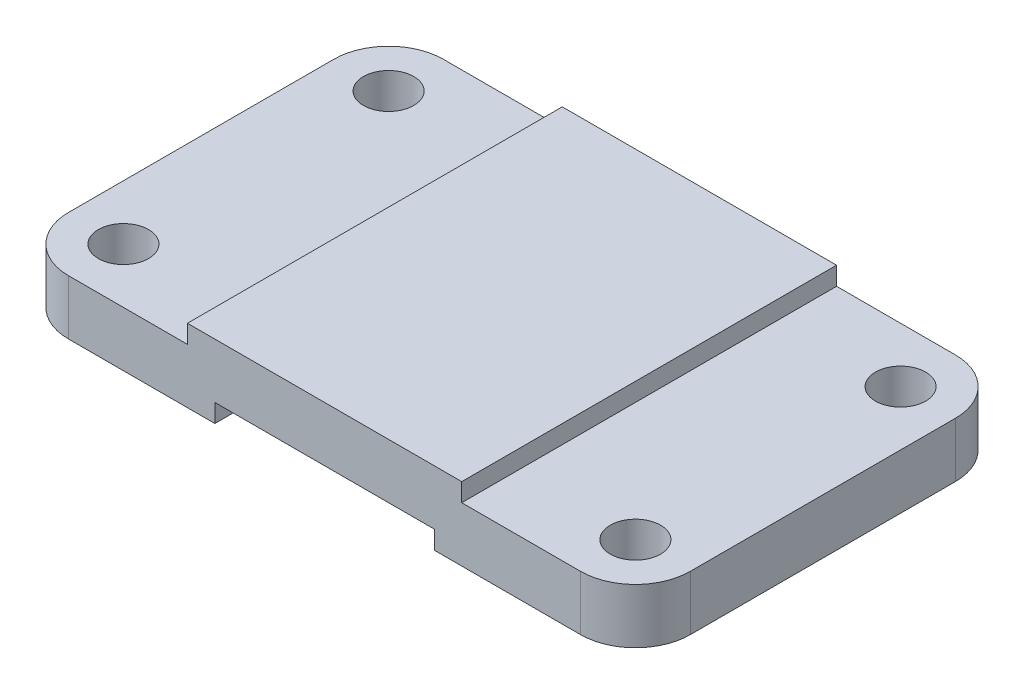
ISO-10303-21;
HEADER;
FILE_DESCRIPTION(('STEP AP214'),'2;1');
FILE_NAME('part.step','',(''),(''),'','','');
FILE_SCHEMA(('AUTOMOTIVE_DESIGN { 1 0 10303 214 1 1 1 1 }'));
ENDSEC;
DATA;
#1=APPLICATION_CONTEXT('core data for automotive mechanical design processes');
#2=APPLICATION_PROTOCOL_DEFINITION('international standard','automotive_design',2000,#1);
#3=PRODUCT_CONTEXT('',#1,'mechanical');
#4=PRODUCT('Part','Part','',(#3));
#5=PRODUCT_RELATED_PRODUCT_CATEGORY('part','',(#4));
#6=PRODUCT_DEFINITION_FORMATION('','',#4);
#7=PRODUCT_DEFINITION_CONTEXT('part definition',#1,'design');
#8=PRODUCT_DEFINITION('design','',#6,#7);
#9=PRODUCT_DEFINITION_SHAPE('','',#8);
#10=(LENGTH_UNIT() NAMED_UNIT(*) SI_UNIT(.MILLI.,.METRE.));
#11=(NAMED_UNIT(*) PLANE_ANGLE_UNIT() SI_UNIT($,.RADIAN.));
#12=(NAMED_UNIT(*) SI_UNIT($,.STERADIAN.) SOLID_ANGLE_UNIT());
#13=UNCERTAINTY_MEASURE_WITH_UNIT(LENGTH_MEASURE(1.E-05),#10,'distance_accuracy_value','');
#14=(GEOMETRIC_REPRESENTATION_CONTEXT(3) GLOBAL_UNCERTAINTY_ASSIGNED_CONTEXT((#13)) GLOBAL_UNIT_ASSIGNED_CONTEXT((#10,
#11,#12)) REPRESENTATION_CONTEXT('',''));
#15=CARTESIAN_POINT('',(0.,0.,0.));
#16=DIRECTION('',(0.,0.,1.));
#17=DIRECTION('',(1.,0.,0.));
#18=AXIS2_PLACEMENT_3D('',#15,#16,#17);
#19=CARTESIAN_POINT('',(0.,0.,0.));
#20=DIRECTION('',(0.,-1.,0.));
#21=DIRECTION('',(0.,0.,-1.));
#22=AXIS2_PLACEMENT_3D('',#19,#20,#21);
#23=PLANE('',#22);
#24=CARTESIAN_POINT('',(-56.,0.,-29.));
#25=DIRECTION('',(0.,1.,0.));
#26=DIRECTION('',(0.,0.,1.));
#27=AXIS2_PLACEMENT_3D('',#24,#25,#26);
#28=CIRCLE('',#27,5.5);
#29=CARTESIAN_POINT('',(-56.,0.,-23.5));
#30=VERTEX_POINT('',#29);
#31=EDGE_CURVE('E515',#30,#30,#28,.T.);
#32=ORIENTED_EDGE('',*,*,#31,.T.);
#33=EDGE_LOOP('',(#32));
#34=FACE_BOUND('',#33,.T.);
#35=CARTESIAN_POINT('',(-56.,0.,29.));
#36=DIRECTION('',(0.,1.,0.));
#37=DIRECTION('',(0.,0.,1.));
#38=AXIS2_PLACEMENT_3D('',#35,#36,#37);
#39=CIRCLE('',#38,5.5);
#40=CARTESIAN_POINT('',(-56.,0.,34.5));
#41=VERTEX_POINT('',#40);
#42=EDGE_CURVE('E215',#41,#41,#39,.T.);
#43=ORIENTED_EDGE('',*,*,#42,.T.);
#44=EDGE_LOOP('',(#43));
#45=FACE_BOUND('',#44,.T.);
#46=DIRECTION('',(1.,0.,0.));
#47=VECTOR('',#46,1.);
#48=CARTESIAN_POINT('',(-68.,0.,41.));
#49=LINE('',#48,#47);
#50=CARTESIAN_POINT('',(-56.,0.,41.));
#51=VERTEX_POINT('',#50);
#52=CARTESIAN_POINT('',(-24.,0.,41.));
#53=VERTEX_POINT('',#52);
#54=EDGE_CURVE('E226',#51,#53,#49,.T.);
#55=ORIENTED_EDGE('',*,*,#54,.F.);
#56=CARTESIAN_POINT('',(-56.,0.,29.));
#57=DIRECTION('',(0.,-1.,0.));
#58=DIRECTION('',(0.,0.,-1.));
#59=AXIS2_PLACEMENT_3D('',#56,#57,#58);
#60=CIRCLE('',#59,12.);
#61=CARTESIAN_POINT('',(-68.,0.,29.));
#62=VERTEX_POINT('',#61);
#63=EDGE_CURVE('E262',#51,#62,#60,.T.);
#64=ORIENTED_EDGE('',*,*,#63,.T.);
#65=DIRECTION('',(0.,0.,1.));
#66=VECTOR('',#65,1.);
#67=CARTESIAN_POINT('',(-68.,0.,41.));
#68=LINE('',#67,#66);
#69=CARTESIAN_POINT('',(-68.,0.,-29.));
#70=VERTEX_POINT('',#69);
#71=EDGE_CURVE('E235',#70,#62,#68,.T.);
#72=ORIENTED_EDGE('',*,*,#71,.F.);
#73=CARTESIAN_POINT('',(-56.,0.,-29.));
#74=DIRECTION('',(0.,-1.,0.));
#75=DIRECTION('',(0.,0.,-1.));
#76=AXIS2_PLACEMENT_3D('',#73,#74,#75);
#77=CIRCLE('',#76,12.);
#78=CARTESIAN_POINT('',(-56.,0.,-41.));
#79=VERTEX_POINT('',#78);
#80=EDGE_CURVE('E260',#70,#79,#77,.T.);
#81=ORIENTED_EDGE('',*,*,#80,.T.);
#82=DIRECTION('',(-1.,0.,0.));
#83=VECTOR('',#82,1.);
#84=CARTESIAN_POINT('',(-68.,0.,-41.));
#85=LINE('',#84,#83);
#86=CARTESIAN_POINT('',(-24.,0.,-41.));
#87=VERTEX_POINT('',#86);
#88=EDGE_CURVE('E232',#87,#79,#85,.T.);
#89=ORIENTED_EDGE('',*,*,#88,.F.);
#90=DIRECTION('',(0.,0.,1.));
#91=VECTOR('',#90,1.);
#92=CARTESIAN_POINT('',(-24.,0.,-41.));
#93=LINE('',#92,#91);
#94=EDGE_CURVE('E174',#87,#53,#93,.T.);
#95=ORIENTED_EDGE('',*,*,#94,.T.);
#96=EDGE_LOOP('',(#55,#64,#72,#81,#89,#95));
#97=FACE_BOUND('',#96,.T.);
#98=ADVANCED_FACE('F32',(#34,#45,#97),#23,.T.);
#99=CARTESIAN_POINT('',(68.,16.,41.));
#100=DIRECTION('',(-1.,0.,0.));
#101=DIRECTION('',(0.,0.,1.));
#102=AXIS2_PLACEMENT_3D('',#99,#100,#101);
#103=PLANE('',#102);
#104=DIRECTION('',(0.,0.,1.));
#105=VECTOR('',#104,1.);
#106=CARTESIAN_POINT('',(68.,12.,-41.));
#107=LINE('',#106,#105);
#108=CARTESIAN_POINT('',(68.,12.,-29.));
#109=VERTEX_POINT('',#108);
#110=CARTESIAN_POINT('',(68.,12.,29.));
#111=VERTEX_POINT('',#110);
#112=EDGE_CURVE('E193',#109,#111,#107,.T.);
#113=ORIENTED_EDGE('',*,*,#112,.T.);
#114=DIRECTION('',(0.,-1.,0.));
#115=VECTOR('',#114,1.);
#116=CARTESIAN_POINT('',(68.,16.,29.));
#117=LINE('',#116,#115);
#118=CARTESIAN_POINT('',(68.,0.,29.));
#119=VERTEX_POINT('',#118);
#120=EDGE_CURVE('E240',#111,#119,#117,.T.);
#121=ORIENTED_EDGE('',*,*,#120,.T.);
#122=DIRECTION('',(0.,0.,-1.));
#123=VECTOR('',#122,1.);
#124=CARTESIAN_POINT('',(68.,0.,41.));
#125=LINE('',#124,#123);
#126=CARTESIAN_POINT('',(68.,0.,-29.));
#127=VERTEX_POINT('',#126);
#128=EDGE_CURVE('E176',#119,#127,#125,.T.);
#129=ORIENTED_EDGE('',*,*,#128,.T.);
#130=DIRECTION('',(0.,-1.,0.));
#131=VECTOR('',#130,1.);
#132=CARTESIAN_POINT('',(68.,16.,-29.));
#133=LINE('',#132,#131);
#134=EDGE_CURVE('E229',#127,#109,#133,.F.);
#135=ORIENTED_EDGE('',*,*,#134,.T.);
#136=EDGE_LOOP('',(#113,#121,#129,#135));
#137=FACE_BOUND('',#136,.T.);
#138=ADVANCED_FACE('F328',(#137),#103,.F.);
#139=CARTESIAN_POINT('',(-68.,16.,-41.));
#140=DIRECTION('',(0.,0.,1.));
#141=DIRECTION('',(1.,0.,0.));
#142=AXIS2_PLACEMENT_3D('',#139,#140,#141);
#143=PLANE('',#142);
#144=DIRECTION('',(1.,0.,0.));
#145=VECTOR('',#144,1.);
#146=CARTESIAN_POINT('',(68.,12.,-41.));
#147=LINE('',#146,#145);
#148=CARTESIAN_POINT('',(30.,12.,-41.));
#149=VERTEX_POINT('',#148);
#150=CARTESIAN_POINT('',(56.,12.,-41.));
#151=VERTEX_POINT('',#150);
#152=EDGE_CURVE('E208',#149,#151,#147,.T.);
#153=ORIENTED_EDGE('',*,*,#152,.T.);
#154=DIRECTION('',(0.,-1.,0.));
#155=VECTOR('',#154,1.);
#156=CARTESIAN_POINT('',(56.,16.,-41.));
#157=LINE('',#156,#155);
#158=CARTESIAN_POINT('',(56.,0.,-41.));
#159=VERTEX_POINT('',#158);
#160=EDGE_CURVE('E257',#151,#159,#157,.T.);
#161=ORIENTED_EDGE('',*,*,#160,.T.);
#162=CARTESIAN_POINT('',(24.,0.,-41.));
#163=VERTEX_POINT('',#162);
#164=EDGE_CURVE('E233',#159,#163,#85,.T.);
#165=ORIENTED_EDGE('',*,*,#164,.T.);
#166=DIRECTION('',(0.,1.,0.));
#167=VECTOR('',#166,1.);
#168=CARTESIAN_POINT('',(24.,0.,-41.));
#169=LINE('',#168,#167);
#170=CARTESIAN_POINT('',(24.,4.00000000000001,-41.));
#171=VERTEX_POINT('',#170);
#172=EDGE_CURVE('E178',#163,#171,#169,.T.);
#173=ORIENTED_EDGE('',*,*,#172,.T.);
#174=DIRECTION('',(-1.,0.,0.));
#175=VECTOR('',#174,1.);
#176=CARTESIAN_POINT('',(-24.,4.,-41.));
#177=LINE('',#176,#175);
#178=CARTESIAN_POINT('',(-24.,4.,-41.));
#179=VERTEX_POINT('',#178);
#180=EDGE_CURVE('E181',#171,#179,#177,.T.);
#181=ORIENTED_EDGE('',*,*,#180,.T.);
#182=DIRECTION('',(0.,-1.,0.));
#183=VECTOR('',#182,1.);
#184=CARTESIAN_POINT('',(-24.,0.,-41.));
#185=LINE('',#184,#183);
#186=EDGE_CURVE('E185',#179,#87,#185,.T.);
#187=ORIENTED_EDGE('',*,*,#186,.T.);
#188=ORIENTED_EDGE('',*,*,#88,.T.);
#189=DIRECTION('',(0.,-1.,0.));
#190=VECTOR('',#189,1.);
#191=CARTESIAN_POINT('',(-56.,16.,-41.));
#192=LINE('',#191,#190);
#193=CARTESIAN_POINT('',(-56.,12.,-41.));
#194=VERTEX_POINT('',#193);
#195=EDGE_CURVE('E154',#79,#194,#192,.F.);
#196=ORIENTED_EDGE('',*,*,#195,.T.);
#197=DIRECTION('',(1.,0.,0.));
#198=VECTOR('',#197,1.);
#199=CARTESIAN_POINT('',(-68.,12.,-41.));
#200=LINE('',#199,#198);
#201=CARTESIAN_POINT('',(-30.,12.,-41.));
#202=VERTEX_POINT('',#201);
#203=EDGE_CURVE('E144',#194,#202,#200,.T.);
#204=ORIENTED_EDGE('',*,*,#203,.T.);
#205=DIRECTION('',(0.,1.,0.));
#206=VECTOR('',#205,1.);
#207=CARTESIAN_POINT('',(-30.,12.,-41.));
#208=LINE('',#207,#206);
#209=CARTESIAN_POINT('',(-30.,16.,-41.));
#210=VERTEX_POINT('',#209);
#211=EDGE_CURVE('E150',#202,#210,#208,.T.);
#212=ORIENTED_EDGE('',*,*,#211,.T.);
#213=DIRECTION('',(-1.,0.,0.));
#214=VECTOR('',#213,1.);
#215=CARTESIAN_POINT('',(-68.,16.,-41.));
#216=LINE('',#215,#214);
#217=CARTESIAN_POINT('',(30.,16.,-41.));
#218=VERTEX_POINT('',#217);
#219=EDGE_CURVE('E223',#218,#210,#216,.T.);
#220=ORIENTED_EDGE('',*,*,#219,.F.);
#221=DIRECTION('',(0.,-1.,0.));
#222=VECTOR('',#221,1.);
#223=CARTESIAN_POINT('',(30.,12.,-41.));
#224=LINE('',#223,#222);
#225=EDGE_CURVE('E205',#218,#149,#224,.T.);
#226=ORIENTED_EDGE('',*,*,#225,.T.);
#227=EDGE_LOOP('',(#153,#161,#165,#173,#181,#187,#188,#196,#204,#212,#220,#226));
#228=FACE_BOUND('',#227,.T.);
#229=ADVANCED_FACE('F147',(#228),#143,.F.);
#230=CARTESIAN_POINT('',(-68.,16.,41.));
#231=DIRECTION('',(1.,0.,0.));
#232=DIRECTION('',(0.,0.,-1.));
#233=AXIS2_PLACEMENT_3D('',#230,#231,#232);
#234=PLANE('',#233);
#235=ORIENTED_EDGE('',*,*,#71,.T.);
#236=DIRECTION('',(0.,-1.,0.));
#237=VECTOR('',#236,1.);
#238=CARTESIAN_POINT('',(-68.,16.,29.));
#239=LINE('',#238,#237);
#240=CARTESIAN_POINT('',(-68.,12.,29.));
#241=VERTEX_POINT('',#240);
#242=EDGE_CURVE('E47',#62,#241,#239,.F.);
#243=ORIENTED_EDGE('',*,*,#242,.T.);
#244=DIRECTION('',(0.,0.,1.));
#245=VECTOR('',#244,1.);
#246=CARTESIAN_POINT('',(-68.,12.,-41.));
#247=LINE('',#246,#245);
#248=CARTESIAN_POINT('',(-68.,12.,-29.));
#249=VERTEX_POINT('',#248);
#250=EDGE_CURVE('E165',#249,#241,#247,.T.);
#251=ORIENTED_EDGE('',*,*,#250,.F.);
#252=DIRECTION('',(0.,-1.,0.));
#253=VECTOR('',#252,1.);
#254=CARTESIAN_POINT('',(-68.,16.,-29.));
#255=LINE('',#254,#253);
#256=EDGE_CURVE('E264',#249,#70,#255,.T.);
#257=ORIENTED_EDGE('',*,*,#256,.T.);
#258=EDGE_LOOP('',(#235,#243,#251,#257));
#259=FACE_BOUND('',#258,.T.);
#260=ADVANCED_FACE('F269',(#259),#234,.F.);
#261=CARTESIAN_POINT('',(-68.,16.,41.));
#262=DIRECTION('',(0.,0.,-1.));
#263=DIRECTION('',(-1.,0.,0.));
#264=AXIS2_PLACEMENT_3D('',#261,#262,#263);
#265=PLANE('',#264);
#266=CARTESIAN_POINT('',(24.,0.,41.));
#267=VERTEX_POINT('',#266);
#268=CARTESIAN_POINT('',(56.,0.,41.));
#269=VERTEX_POINT('',#268);
#270=EDGE_CURVE('E237',#267,#269,#49,.T.);
#271=ORIENTED_EDGE('',*,*,#270,.T.);
#272=DIRECTION('',(0.,-1.,0.));
#273=VECTOR('',#272,1.);
#274=CARTESIAN_POINT('',(56.,16.,41.));
#275=LINE('',#274,#273);
#276=CARTESIAN_POINT('',(56.,12.,41.));
#277=VERTEX_POINT('',#276);
#278=EDGE_CURVE('E250',#269,#277,#275,.F.);
#279=ORIENTED_EDGE('',*,*,#278,.T.);
#280=DIRECTION('',(1.,0.,0.));
#281=VECTOR('',#280,1.);
#282=CARTESIAN_POINT('',(68.,12.,41.));
#283=LINE('',#282,#281);
#284=CARTESIAN_POINT('',(30.,12.,41.));
#285=VERTEX_POINT('',#284);
#286=EDGE_CURVE('E209',#285,#277,#283,.T.);
#287=ORIENTED_EDGE('',*,*,#286,.F.);
#288=DIRECTION('',(0.,-1.,0.));
#289=VECTOR('',#288,1.);
#290=CARTESIAN_POINT('',(30.,12.,41.));
#291=LINE('',#290,#289);
#292=CARTESIAN_POINT('',(30.,16.,41.));
#293=VERTEX_POINT('',#292);
#294=EDGE_CURVE('E212',#293,#285,#291,.T.);
#295=ORIENTED_EDGE('',*,*,#294,.F.);
#296=DIRECTION('',(1.,0.,0.));
#297=VECTOR('',#296,1.);
#298=CARTESIAN_POINT('',(-68.,16.,41.));
#299=LINE('',#298,#297);
#300=CARTESIAN_POINT('',(-30.,16.,41.));
#301=VERTEX_POINT('',#300);
#302=EDGE_CURVE('E225',#301,#293,#299,.T.);
#303=ORIENTED_EDGE('',*,*,#302,.F.);
#304=DIRECTION('',(0.,1.,0.));
#305=VECTOR('',#304,1.);
#306=CARTESIAN_POINT('',(-30.,12.,41.));
#307=LINE('',#306,#305);
#308=CARTESIAN_POINT('',(-30.,12.,41.));
#309=VERTEX_POINT('',#308);
#310=EDGE_CURVE('E155',#309,#301,#307,.T.);
#311=ORIENTED_EDGE('',*,*,#310,.F.);
#312=DIRECTION('',(1.,0.,0.));
#313=VECTOR('',#312,1.);
#314=CARTESIAN_POINT('',(-68.,12.,41.));
#315=LINE('',#314,#313);
#316=CARTESIAN_POINT('',(-56.,12.,41.));
#317=VERTEX_POINT('',#316);
#318=EDGE_CURVE('E161',#317,#309,#315,.T.);
#319=ORIENTED_EDGE('',*,*,#318,.F.);
#320=DIRECTION('',(0.,-1.,0.));
#321=VECTOR('',#320,1.);
#322=CARTESIAN_POINT('',(-56.,16.,41.));
#323=LINE('',#322,#321);
#324=EDGE_CURVE('E247',#317,#51,#323,.T.);
#325=ORIENTED_EDGE('',*,*,#324,.T.);
#326=ORIENTED_EDGE('',*,*,#54,.T.);
#327=DIRECTION('',(0.,-1.,0.));
#328=VECTOR('',#327,1.);
#329=CARTESIAN_POINT('',(-24.,0.,41.));
#330=LINE('',#329,#328);
#331=CARTESIAN_POINT('',(-24.,4.,41.));
#332=VERTEX_POINT('',#331);
#333=EDGE_CURVE('E182',#332,#53,#330,.T.);
#334=ORIENTED_EDGE('',*,*,#333,.F.);
#335=DIRECTION('',(-1.,0.,0.));
#336=VECTOR('',#335,1.);
#337=CARTESIAN_POINT('',(-24.,4.,41.));
#338=LINE('',#337,#336);
#339=CARTESIAN_POINT('',(24.,4.00000000000001,41.));
#340=VERTEX_POINT('',#339);
#341=EDGE_CURVE('E192',#340,#332,#338,.T.);
#342=ORIENTED_EDGE('',*,*,#341,.F.);
#343=DIRECTION('',(0.,1.,0.));
#344=VECTOR('',#343,1.);
#345=CARTESIAN_POINT('',(24.,0.,41.));
#346=LINE('',#345,#344);
#347=EDGE_CURVE('E189',#267,#340,#346,.T.);
#348=ORIENTED_EDGE('',*,*,#347,.F.);
#349=EDGE_LOOP('',(#271,#279,#287,#295,#303,#311,#319,#325,#326,#334,#342,#348));
#350=FACE_BOUND('',#349,.T.);
#351=ADVANCED_FACE('F280',(#350),#265,.F.);
#352=CARTESIAN_POINT('',(0.,16.,0.));
#353=DIRECTION('',(0.,-1.,0.));
#354=DIRECTION('',(0.,0.,-1.));
#355=AXIS2_PLACEMENT_3D('',#352,#353,#354);
#356=PLANE('',#355);
#357=ORIENTED_EDGE('',*,*,#219,.T.);
#358=DIRECTION('',(0.,0.,1.));
#359=VECTOR('',#358,1.);
#360=CARTESIAN_POINT('',(-30.,16.,-41.));
#361=LINE('',#360,#359);
#362=EDGE_CURVE('E164',#210,#301,#361,.T.);
#363=ORIENTED_EDGE('',*,*,#362,.T.);
#364=ORIENTED_EDGE('',*,*,#302,.T.);
#365=DIRECTION('',(0.,0.,1.));
#366=VECTOR('',#365,1.);
#367=CARTESIAN_POINT('',(30.,16.,-41.));
#368=LINE('',#367,#366);
#369=EDGE_CURVE('E211',#218,#293,#368,.T.);
#370=ORIENTED_EDGE('',*,*,#369,.F.);
#371=EDGE_LOOP('',(#357,#363,#364,#370));
#372=FACE_BOUND('',#371,.T.);
#373=ADVANCED_FACE('F285',(#372),#356,.F.);
#374=CARTESIAN_POINT('',(56.,0.,29.));
#375=DIRECTION('',(0.,1.,0.));
#376=DIRECTION('',(0.,0.,1.));
#377=AXIS2_PLACEMENT_3D('',#374,#375,#376);
#378=CIRCLE('',#377,5.5);
#379=CARTESIAN_POINT('',(56.,0.,34.5));
#380=VERTEX_POINT('',#379);
#381=EDGE_CURVE('E523',#380,#380,#378,.T.);
#382=ORIENTED_EDGE('',*,*,#381,.T.);
#383=EDGE_LOOP('',(#382));
#384=FACE_BOUND('',#383,.T.);
#385=CARTESIAN_POINT('',(56.,0.,-29.));
#386=DIRECTION('',(0.,1.,0.));
#387=DIRECTION('',(0.,0.,1.));
#388=AXIS2_PLACEMENT_3D('',#385,#386,#387);
#389=CIRCLE('',#388,5.5);
#390=CARTESIAN_POINT('',(56.,0.,-23.5));
#391=VERTEX_POINT('',#390);
#392=EDGE_CURVE('E524',#391,#391,#389,.T.);
#393=ORIENTED_EDGE('',*,*,#392,.T.);
#394=EDGE_LOOP('',(#393));
#395=FACE_BOUND('',#394,.T.);
#396=ORIENTED_EDGE('',*,*,#128,.F.);
#397=CARTESIAN_POINT('',(56.,0.,29.));
#398=DIRECTION('',(0.,-1.,0.));
#399=DIRECTION('',(0.,0.,-1.));
#400=AXIS2_PLACEMENT_3D('',#397,#398,#399);
#401=CIRCLE('',#400,12.);
#402=EDGE_CURVE('E245',#119,#269,#401,.T.);
#403=ORIENTED_EDGE('',*,*,#402,.T.);
#404=ORIENTED_EDGE('',*,*,#270,.F.);
#405=DIRECTION('',(0.,0.,1.));
#406=VECTOR('',#405,1.);
#407=CARTESIAN_POINT('',(24.,0.,-41.));
#408=LINE('',#407,#406);
#409=EDGE_CURVE('E188',#163,#267,#408,.T.);
#410=ORIENTED_EDGE('',*,*,#409,.F.);
#411=ORIENTED_EDGE('',*,*,#164,.F.);
#412=CARTESIAN_POINT('',(56.,0.,-29.));
#413=DIRECTION('',(0.,-1.,0.));
#414=DIRECTION('',(0.,0.,-1.));
#415=AXIS2_PLACEMENT_3D('',#412,#413,#414);
#416=CIRCLE('',#415,12.);
#417=EDGE_CURVE('E243',#159,#127,#416,.T.);
#418=ORIENTED_EDGE('',*,*,#417,.T.);
#419=EDGE_LOOP('',(#396,#403,#404,#410,#411,#418));
#420=FACE_BOUND('',#419,.T.);
#421=ADVANCED_FACE('F304',(#384,#395,#420),#23,.T.);
#422=CARTESIAN_POINT('',(-24.,0.,-41.));
#423=DIRECTION('',(-1.,0.,0.));
#424=DIRECTION('',(0.,0.,1.));
#425=AXIS2_PLACEMENT_3D('',#422,#423,#424);
#426=PLANE('',#425);
#427=ORIENTED_EDGE('',*,*,#333,.T.);
#428=ORIENTED_EDGE('',*,*,#94,.F.);
#429=ORIENTED_EDGE('',*,*,#186,.F.);
#430=DIRECTION('',(0.,0.,1.));
#431=VECTOR('',#430,1.);
#432=CARTESIAN_POINT('',(-24.,4.,-41.));
#433=LINE('',#432,#431);
#434=EDGE_CURVE('E200',#179,#332,#433,.T.);
#435=ORIENTED_EDGE('',*,*,#434,.T.);
#436=EDGE_LOOP('',(#427,#428,#429,#435));
#437=FACE_BOUND('',#436,.T.);
#438=ADVANCED_FACE('F316',(#437),#426,.F.);
#439=CARTESIAN_POINT('',(-24.,4.,-41.));
#440=DIRECTION('',(0.,1.,0.));
#441=DIRECTION('',(-1.,0.,0.));
#442=AXIS2_PLACEMENT_3D('',#439,#440,#441);
#443=PLANE('',#442);
#444=ORIENTED_EDGE('',*,*,#341,.T.);
#445=ORIENTED_EDGE('',*,*,#434,.F.);
#446=ORIENTED_EDGE('',*,*,#180,.F.);
#447=DIRECTION('',(0.,0.,1.));
#448=VECTOR('',#447,1.);
#449=CARTESIAN_POINT('',(24.,4.00000000000001,-41.));
#450=LINE('',#449,#448);
#451=EDGE_CURVE('E202',#171,#340,#450,.T.);
#452=ORIENTED_EDGE('',*,*,#451,.T.);
#453=EDGE_LOOP('',(#444,#445,#446,#452));
#454=FACE_BOUND('',#453,.T.);
#455=ADVANCED_FACE('F312',(#454),#443,.F.);
#456=CARTESIAN_POINT('',(24.,0.,-41.));
#457=DIRECTION('',(1.,0.,0.));
#458=DIRECTION('',(0.,0.,-1.));
#459=AXIS2_PLACEMENT_3D('',#456,#457,#458);
#460=PLANE('',#459);
#461=ORIENTED_EDGE('',*,*,#347,.T.);
#462=ORIENTED_EDGE('',*,*,#451,.F.);
#463=ORIENTED_EDGE('',*,*,#172,.F.);
#464=ORIENTED_EDGE('',*,*,#409,.T.);
#465=EDGE_LOOP('',(#461,#462,#463,#464));
#466=FACE_BOUND('',#465,.T.);
#467=ADVANCED_FACE('F308',(#466),#460,.F.);
#468=CARTESIAN_POINT('',(68.,12.,-41.));
#469=DIRECTION('',(0.,-1.,0.));
#470=DIRECTION('',(1.,0.,0.));
#471=AXIS2_PLACEMENT_3D('',#468,#469,#470);
#472=PLANE('',#471);
#473=CARTESIAN_POINT('',(56.,12.,29.));
#474=DIRECTION('',(0.,1.,0.));
#475=DIRECTION('',(0.,0.,1.));
#476=AXIS2_PLACEMENT_3D('',#473,#474,#475);
#477=CIRCLE('',#476,5.5);
#478=CARTESIAN_POINT('',(56.,12.,34.5));
#479=VERTEX_POINT('',#478);
#480=EDGE_CURVE('E520',#479,#479,#477,.T.);
#481=ORIENTED_EDGE('',*,*,#480,.F.);
#482=EDGE_LOOP('',(#481));
#483=FACE_BOUND('',#482,.T.);
#484=CARTESIAN_POINT('',(56.,12.,-29.));
#485=DIRECTION('',(0.,1.,0.));
#486=DIRECTION('',(0.,0.,1.));
#487=AXIS2_PLACEMENT_3D('',#484,#485,#486);
#488=CIRCLE('',#487,5.5);
#489=CARTESIAN_POINT('',(56.,12.,-23.5));
#490=VERTEX_POINT('',#489);
#491=EDGE_CURVE('E529',#490,#490,#488,.T.);
#492=ORIENTED_EDGE('',*,*,#491,.F.);
#493=EDGE_LOOP('',(#492));
#494=FACE_BOUND('',#493,.T.);
#495=ORIENTED_EDGE('',*,*,#286,.T.);
#496=CARTESIAN_POINT('',(56.,12.,29.));
#497=DIRECTION('',(0.,-1.,0.));
#498=DIRECTION('',(1.,0.,0.));
#499=AXIS2_PLACEMENT_3D('',#496,#497,#498);
#500=CIRCLE('',#499,12.);
#501=EDGE_CURVE('E254',#277,#111,#500,.F.);
#502=ORIENTED_EDGE('',*,*,#501,.T.);
#503=ORIENTED_EDGE('',*,*,#112,.F.);
#504=CARTESIAN_POINT('',(56.,12.,-29.));
#505=DIRECTION('',(0.,-1.,0.));
#506=DIRECTION('',(1.,0.,0.));
#507=AXIS2_PLACEMENT_3D('',#504,#505,#506);
#508=CIRCLE('',#507,12.);
#509=EDGE_CURVE('E252',#109,#151,#508,.F.);
#510=ORIENTED_EDGE('',*,*,#509,.T.);
#511=ORIENTED_EDGE('',*,*,#152,.F.);
#512=DIRECTION('',(0.,0.,1.));
#513=VECTOR('',#512,1.);
#514=CARTESIAN_POINT('',(30.,12.,-41.));
#515=LINE('',#514,#513);
#516=EDGE_CURVE('E220',#149,#285,#515,.T.);
#517=ORIENTED_EDGE('',*,*,#516,.T.);
#518=EDGE_LOOP('',(#495,#502,#503,#510,#511,#517));
#519=FACE_BOUND('',#518,.T.);
#520=ADVANCED_FACE('F293',(#483,#494,#519),#472,.F.);
#521=CARTESIAN_POINT('',(30.,12.,-41.));
#522=DIRECTION('',(-1.,0.,0.));
#523=DIRECTION('',(0.,0.,1.));
#524=AXIS2_PLACEMENT_3D('',#521,#522,#523);
#525=PLANE('',#524);
#526=ORIENTED_EDGE('',*,*,#294,.T.);
#527=ORIENTED_EDGE('',*,*,#516,.F.);
#528=ORIENTED_EDGE('',*,*,#225,.F.);
#529=ORIENTED_EDGE('',*,*,#369,.T.);
#530=EDGE_LOOP('',(#526,#527,#528,#529));
#531=FACE_BOUND('',#530,.T.);
#532=ADVANCED_FACE('F290',(#531),#525,.F.);
#533=CARTESIAN_POINT('',(-30.,12.,-41.));
#534=DIRECTION('',(1.,0.,0.));
#535=DIRECTION('',(0.,0.,-1.));
#536=AXIS2_PLACEMENT_3D('',#533,#534,#535);
#537=PLANE('',#536);
#538=ORIENTED_EDGE('',*,*,#310,.T.);
#539=ORIENTED_EDGE('',*,*,#362,.F.);
#540=ORIENTED_EDGE('',*,*,#211,.F.);
#541=DIRECTION('',(0.,0.,1.));
#542=VECTOR('',#541,1.);
#543=CARTESIAN_POINT('',(-30.,12.,-41.));
#544=LINE('',#543,#542);
#545=EDGE_CURVE('E158',#202,#309,#544,.T.);
#546=ORIENTED_EDGE('',*,*,#545,.T.);
#547=EDGE_LOOP('',(#538,#539,#540,#546));
#548=FACE_BOUND('',#547,.T.);
#549=ADVANCED_FACE('F167',(#548),#537,.F.);
#550=CARTESIAN_POINT('',(-68.,12.,-41.));
#551=DIRECTION('',(0.,-1.,0.));
#552=DIRECTION('',(0.,0.,-1.));
#553=AXIS2_PLACEMENT_3D('',#550,#551,#552);
#554=PLANE('',#553);
#555=CARTESIAN_POINT('',(-56.,12.,-29.));
#556=DIRECTION('',(0.,1.,0.));
#557=DIRECTION('',(0.,0.,1.));
#558=AXIS2_PLACEMENT_3D('',#555,#556,#557);
#559=CIRCLE('',#558,5.5);
#560=CARTESIAN_POINT('',(-56.,12.,-23.5));
#561=VERTEX_POINT('',#560);
#562=EDGE_CURVE('E517',#561,#561,#559,.T.);
#563=ORIENTED_EDGE('',*,*,#562,.F.);
#564=EDGE_LOOP('',(#563));
#565=FACE_BOUND('',#564,.T.);
#566=CARTESIAN_POINT('',(-56.,12.,29.));
#567=DIRECTION('',(0.,1.,0.));
#568=DIRECTION('',(0.,0.,1.));
#569=AXIS2_PLACEMENT_3D('',#566,#567,#568);
#570=CIRCLE('',#569,5.5);
#571=CARTESIAN_POINT('',(-56.,12.,34.5));
#572=VERTEX_POINT('',#571);
#573=EDGE_CURVE('E513',#572,#572,#570,.T.);
#574=ORIENTED_EDGE('',*,*,#573,.F.);
#575=EDGE_LOOP('',(#574));
#576=FACE_BOUND('',#575,.T.);
#577=ORIENTED_EDGE('',*,*,#250,.T.);
#578=CARTESIAN_POINT('',(-56.,12.,29.));
#579=DIRECTION('',(0.,-1.,0.));
#580=DIRECTION('',(0.,0.,-1.));
#581=AXIS2_PLACEMENT_3D('',#578,#579,#580);
#582=CIRCLE('',#581,12.);
#583=EDGE_CURVE('E11',#241,#317,#582,.F.);
#584=ORIENTED_EDGE('',*,*,#583,.T.);
#585=ORIENTED_EDGE('',*,*,#318,.T.);
#586=ORIENTED_EDGE('',*,*,#545,.F.);
#587=ORIENTED_EDGE('',*,*,#203,.F.);
#588=CARTESIAN_POINT('',(-56.,12.,-29.));
#589=DIRECTION('',(0.,-1.,0.));
#590=DIRECTION('',(0.,0.,-1.));
#591=AXIS2_PLACEMENT_3D('',#588,#589,#590);
#592=CIRCLE('',#591,12.);
#593=EDGE_CURVE('E40',#194,#249,#592,.F.);
#594=ORIENTED_EDGE('',*,*,#593,.T.);
#595=EDGE_LOOP('',(#577,#584,#585,#586,#587,#594));
#596=FACE_BOUND('',#595,.T.);
#597=ADVANCED_FACE('F159',(#565,#576,#596),#554,.F.);
#598=CARTESIAN_POINT('',(-56.,0.,29.));
#599=DIRECTION('',(0.,1.,0.));
#600=DIRECTION('',(0.,0.,1.));
#601=AXIS2_PLACEMENT_3D('',#598,#599,#600);
#602=CYLINDRICAL_SURFACE('',#601,5.5);
#603=ORIENTED_EDGE('',*,*,#42,.F.);
#604=EDGE_LOOP('',(#603));
#605=FACE_BOUND('',#604,.T.);
#606=ORIENTED_EDGE('',*,*,#573,.T.);
#607=EDGE_LOOP('',(#606));
#608=FACE_BOUND('',#607,.T.);
#609=ADVANCED_FACE('F385',(#605,#608),#602,.F.);
#610=CARTESIAN_POINT('',(-56.,0.,-29.));
#611=DIRECTION('',(0.,1.,0.));
#612=DIRECTION('',(0.,0.,1.));
#613=AXIS2_PLACEMENT_3D('',#610,#611,#612);
#614=CYLINDRICAL_SURFACE('',#613,5.5);
#615=ORIENTED_EDGE('',*,*,#31,.F.);
#616=EDGE_LOOP('',(#615));
#617=FACE_BOUND('',#616,.T.);
#618=ORIENTED_EDGE('',*,*,#562,.T.);
#619=EDGE_LOOP('',(#618));
#620=FACE_BOUND('',#619,.T.);
#621=ADVANCED_FACE('F456',(#617,#620),#614,.F.);
#622=CARTESIAN_POINT('',(56.,0.,-29.));
#623=DIRECTION('',(0.,1.,0.));
#624=DIRECTION('',(0.,0.,1.));
#625=AXIS2_PLACEMENT_3D('',#622,#623,#624);
#626=CYLINDRICAL_SURFACE('',#625,5.5);
#627=ORIENTED_EDGE('',*,*,#392,.F.);
#628=EDGE_LOOP('',(#627));
#629=FACE_BOUND('',#628,.T.);
#630=ORIENTED_EDGE('',*,*,#491,.T.);
#631=EDGE_LOOP('',(#630));
#632=FACE_BOUND('',#631,.T.);
#633=ADVANCED_FACE('F446',(#629,#632),#626,.F.);
#634=CARTESIAN_POINT('',(56.,0.,29.));
#635=DIRECTION('',(0.,1.,0.));
#636=DIRECTION('',(0.,0.,1.));
#637=AXIS2_PLACEMENT_3D('',#634,#635,#636);
#638=CYLINDRICAL_SURFACE('',#637,5.5);
#639=ORIENTED_EDGE('',*,*,#381,.F.);
#640=EDGE_LOOP('',(#639));
#641=FACE_BOUND('',#640,.T.);
#642=ORIENTED_EDGE('',*,*,#480,.T.);
#643=EDGE_LOOP('',(#642));
#644=FACE_BOUND('',#643,.T.);
#645=ADVANCED_FACE('F349',(#641,#644),#638,.F.);
#646=CARTESIAN_POINT('',(56.,16.,29.));
#647=DIRECTION('',(0.,-1.,0.));
#648=DIRECTION('',(0.,0.,-1.));
#649=AXIS2_PLACEMENT_3D('',#646,#647,#648);
#650=CYLINDRICAL_SURFACE('',#649,12.);
#651=ORIENTED_EDGE('',*,*,#501,.F.);
#652=ORIENTED_EDGE('',*,*,#278,.F.);
#653=ORIENTED_EDGE('',*,*,#402,.F.);
#654=ORIENTED_EDGE('',*,*,#120,.F.);
#655=EDGE_LOOP('',(#651,#652,#653,#654));
#656=FACE_BOUND('',#655,.T.);
#657=ADVANCED_FACE('F346',(#656),#650,.T.);
#658=CARTESIAN_POINT('',(56.,16.,-29.));
#659=DIRECTION('',(0.,-1.,0.));
#660=DIRECTION('',(0.,0.,-1.));
#661=AXIS2_PLACEMENT_3D('',#658,#659,#660);
#662=CYLINDRICAL_SURFACE('',#661,12.);
#663=ORIENTED_EDGE('',*,*,#509,.F.);
#664=ORIENTED_EDGE('',*,*,#134,.F.);
#665=ORIENTED_EDGE('',*,*,#417,.F.);
#666=ORIENTED_EDGE('',*,*,#160,.F.);
#667=EDGE_LOOP('',(#663,#664,#665,#666));
#668=FACE_BOUND('',#667,.T.);
#669=ADVANCED_FACE('F298',(#668),#662,.T.);
#670=CARTESIAN_POINT('',(-56.,16.,29.));
#671=DIRECTION('',(0.,-1.,0.));
#672=DIRECTION('',(0.,0.,-1.));
#673=AXIS2_PLACEMENT_3D('',#670,#671,#672);
#674=CYLINDRICAL_SURFACE('',#673,12.);
#675=ORIENTED_EDGE('',*,*,#583,.F.);
#676=ORIENTED_EDGE('',*,*,#242,.F.);
#677=ORIENTED_EDGE('',*,*,#63,.F.);
#678=ORIENTED_EDGE('',*,*,#324,.F.);
#679=EDGE_LOOP('',(#675,#676,#677,#678));
#680=FACE_BOUND('',#679,.T.);
#681=ADVANCED_FACE('F277',(#680),#674,.T.);
#682=CARTESIAN_POINT('',(-56.,16.,-29.));
#683=DIRECTION('',(0.,-1.,0.));
#684=DIRECTION('',(0.,0.,-1.));
#685=AXIS2_PLACEMENT_3D('',#682,#683,#684);
#686=CYLINDRICAL_SURFACE('',#685,12.);
#687=ORIENTED_EDGE('',*,*,#593,.F.);
#688=ORIENTED_EDGE('',*,*,#195,.F.);
#689=ORIENTED_EDGE('',*,*,#80,.F.);
#690=ORIENTED_EDGE('',*,*,#256,.F.);
#691=EDGE_LOOP('',(#687,#688,#689,#690));
#692=FACE_BOUND('',#691,.T.);
#693=ADVANCED_FACE('F34',(#692),#686,.T.);
#694=CLOSED_SHELL('',(#98,#138,#229,#260,#351,#373,#421,#438,#455,#467,#520,#532,#549,#597,#609,
#621,#633,#645,#657,#669,#681,#693));
#695=MANIFOLD_SOLID_BREP('B2',#694);
#696=ADVANCED_BREP_SHAPE_REPRESENTATION('',(#18,#695),#14);
#697=SHAPE_DEFINITION_REPRESENTATION(#9,#696);
ENDSEC;
END-ISO-10303-21;
